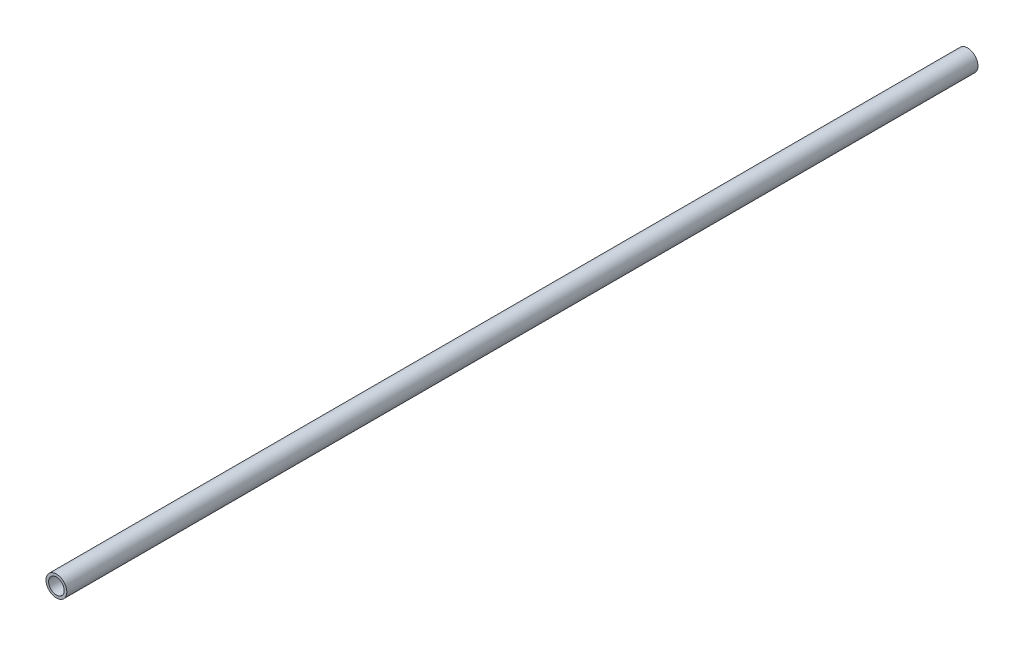
ISO-10303-21;
HEADER;
FILE_DESCRIPTION(('STEP AP214'),'2;1');
FILE_NAME('part.step','',(''),(''),'','','');
FILE_SCHEMA(('AUTOMOTIVE_DESIGN { 1 0 10303 214 1 1 1 1 }'));
ENDSEC;
DATA;
#1=APPLICATION_CONTEXT('core data for automotive mechanical design processes');
#2=APPLICATION_PROTOCOL_DEFINITION('international standard','automotive_design',2000,#1);
#3=PRODUCT_CONTEXT('',#1,'mechanical');
#4=PRODUCT('Part','Part','',(#3));
#5=PRODUCT_RELATED_PRODUCT_CATEGORY('part','',(#4));
#6=PRODUCT_DEFINITION_FORMATION('','',#4);
#7=PRODUCT_DEFINITION_CONTEXT('part definition',#1,'design');
#8=PRODUCT_DEFINITION('design','',#6,#7);
#9=PRODUCT_DEFINITION_SHAPE('','',#8);
#10=(LENGTH_UNIT() NAMED_UNIT(*) SI_UNIT(.MILLI.,.METRE.));
#11=(NAMED_UNIT(*) PLANE_ANGLE_UNIT() SI_UNIT($,.RADIAN.));
#12=(NAMED_UNIT(*) SI_UNIT($,.STERADIAN.) SOLID_ANGLE_UNIT());
#13=UNCERTAINTY_MEASURE_WITH_UNIT(LENGTH_MEASURE(1.E-05),#10,'distance_accuracy_value','');
#14=(GEOMETRIC_REPRESENTATION_CONTEXT(3) GLOBAL_UNCERTAINTY_ASSIGNED_CONTEXT((#13)) GLOBAL_UNIT_ASSIGNED_CONTEXT((#10,
#11,#12)) REPRESENTATION_CONTEXT('',''));
#15=CARTESIAN_POINT('',(0.,0.,0.));
#16=DIRECTION('',(0.,0.,1.));
#17=DIRECTION('',(1.,0.,0.));
#18=AXIS2_PLACEMENT_3D('',#15,#16,#17);
#19=CARTESIAN_POINT('',(0.,0.,-350.));
#20=DIRECTION('',(0.,0.,1.));
#21=DIRECTION('',(1.,0.,0.));
#22=AXIS2_PLACEMENT_3D('',#19,#20,#21);
#23=CYLINDRICAL_SURFACE('',#22,6.);
#24=CARTESIAN_POINT('',(0.,0.,350.));
#25=DIRECTION('',(0.,0.,1.));
#26=DIRECTION('',(1.,0.,0.));
#27=AXIS2_PLACEMENT_3D('',#24,#25,#26);
#28=CIRCLE('',#27,6.);
#29=CARTESIAN_POINT('',(6.,0.,350.));
#30=VERTEX_POINT('',#29);
#31=EDGE_CURVE('E18',#30,#30,#28,.F.);
#32=ORIENTED_EDGE('',*,*,#31,.F.);
#33=EDGE_LOOP('',(#32));
#34=FACE_BOUND('',#33,.T.);
#35=CARTESIAN_POINT('',(0.,0.,-350.));
#36=DIRECTION('',(0.,0.,1.));
#37=DIRECTION('',(1.,0.,0.));
#38=AXIS2_PLACEMENT_3D('',#35,#36,#37);
#39=CIRCLE('',#38,6.);
#40=CARTESIAN_POINT('',(6.,0.,-350.));
#41=VERTEX_POINT('',#40);
#42=EDGE_CURVE('E27',#41,#41,#39,.F.);
#43=ORIENTED_EDGE('',*,*,#42,.T.);
#44=EDGE_LOOP('',(#43));
#45=FACE_BOUND('',#44,.T.);
#46=ADVANCED_FACE('F15',(#34,#45),#23,.F.);
#47=CARTESIAN_POINT('',(0.,0.,350.));
#48=DIRECTION('',(0.,0.,1.));
#49=DIRECTION('',(1.,0.,0.));
#50=AXIS2_PLACEMENT_3D('',#47,#48,#49);
#51=PLANE('',#50);
#52=ORIENTED_EDGE('',*,*,#31,.T.);
#53=EDGE_LOOP('',(#52));
#54=FACE_BOUND('',#53,.T.);
#55=CARTESIAN_POINT('',(0.,0.,350.));
#56=DIRECTION('',(0.,0.,1.));
#57=DIRECTION('',(1.,0.,0.));
#58=AXIS2_PLACEMENT_3D('',#55,#56,#57);
#59=CIRCLE('',#58,8.);
#60=CARTESIAN_POINT('',(8.,0.,350.));
#61=VERTEX_POINT('',#60);
#62=EDGE_CURVE('E22',#61,#61,#59,.F.);
#63=ORIENTED_EDGE('',*,*,#62,.F.);
#64=EDGE_LOOP('',(#63));
#65=FACE_BOUND('',#64,.T.);
#66=ADVANCED_FACE('F35',(#54,#65),#51,.T.);
#67=CARTESIAN_POINT('',(0.,0.,-350.));
#68=DIRECTION('',(0.,0.,1.));
#69=DIRECTION('',(1.,0.,0.));
#70=AXIS2_PLACEMENT_3D('',#67,#68,#69);
#71=PLANE('',#70);
#72=ORIENTED_EDGE('',*,*,#42,.F.);
#73=EDGE_LOOP('',(#72));
#74=FACE_BOUND('',#73,.T.);
#75=CARTESIAN_POINT('',(0.,0.,-350.));
#76=DIRECTION('',(0.,0.,1.));
#77=DIRECTION('',(1.,0.,0.));
#78=AXIS2_PLACEMENT_3D('',#75,#76,#77);
#79=CIRCLE('',#78,8.);
#80=CARTESIAN_POINT('',(8.,0.,-350.));
#81=VERTEX_POINT('',#80);
#82=EDGE_CURVE('E10',#81,#81,#79,.T.);
#83=ORIENTED_EDGE('',*,*,#82,.F.);
#84=EDGE_LOOP('',(#83));
#85=FACE_BOUND('',#84,.T.);
#86=ADVANCED_FACE('F43',(#74,#85),#71,.F.);
#87=CARTESIAN_POINT('',(0.,0.,-350.));
#88=DIRECTION('',(0.,0.,1.));
#89=DIRECTION('',(1.,0.,0.));
#90=AXIS2_PLACEMENT_3D('',#87,#88,#89);
#91=CYLINDRICAL_SURFACE('',#90,8.);
#92=ORIENTED_EDGE('',*,*,#62,.T.);
#93=EDGE_LOOP('',(#92));
#94=FACE_BOUND('',#93,.T.);
#95=ORIENTED_EDGE('',*,*,#82,.T.);
#96=EDGE_LOOP('',(#95));
#97=FACE_BOUND('',#96,.T.);
#98=ADVANCED_FACE('F44',(#94,#97),#91,.T.);
#99=CLOSED_SHELL('',(#46,#66,#86,#98));
#100=MANIFOLD_SOLID_BREP('B1',#99);
#101=ADVANCED_BREP_SHAPE_REPRESENTATION('',(#18,#100),#14);
#102=SHAPE_DEFINITION_REPRESENTATION(#9,#101);
ENDSEC;
END-ISO-10303-21;
